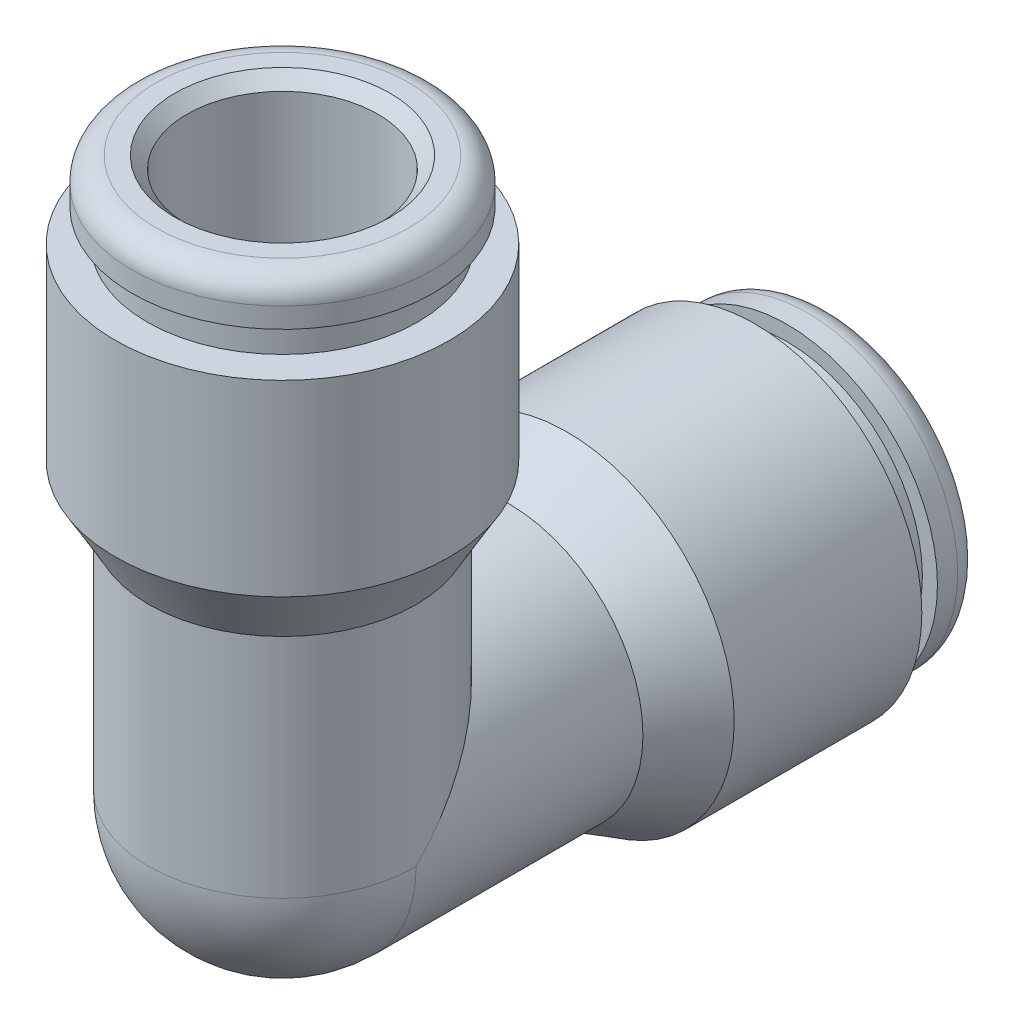
ISO-10303-21;
HEADER;
FILE_DESCRIPTION(('STEP AP214'),'2;1');
FILE_NAME('part.step','',(''),(''),'','','');
FILE_SCHEMA(('AUTOMOTIVE_DESIGN { 1 0 10303 214 1 1 1 1 }'));
ENDSEC;
DATA;
#1=APPLICATION_CONTEXT('core data for automotive mechanical design processes');
#2=APPLICATION_PROTOCOL_DEFINITION('international standard','automotive_design',2000,#1);
#3=PRODUCT_CONTEXT('',#1,'mechanical');
#4=PRODUCT('Part','Part','',(#3));
#5=PRODUCT_RELATED_PRODUCT_CATEGORY('part','',(#4));
#6=PRODUCT_DEFINITION_FORMATION('','',#4);
#7=PRODUCT_DEFINITION_CONTEXT('part definition',#1,'design');
#8=PRODUCT_DEFINITION('design','',#6,#7);
#9=PRODUCT_DEFINITION_SHAPE('','',#8);
#10=(LENGTH_UNIT() NAMED_UNIT(*) SI_UNIT(.MILLI.,.METRE.));
#11=(NAMED_UNIT(*) PLANE_ANGLE_UNIT() SI_UNIT($,.RADIAN.));
#12=(NAMED_UNIT(*) SI_UNIT($,.STERADIAN.) SOLID_ANGLE_UNIT());
#13=UNCERTAINTY_MEASURE_WITH_UNIT(LENGTH_MEASURE(1.E-05),#10,'distance_accuracy_value','');
#14=(GEOMETRIC_REPRESENTATION_CONTEXT(3) GLOBAL_UNCERTAINTY_ASSIGNED_CONTEXT((#13)) GLOBAL_UNIT_ASSIGNED_CONTEXT((#10,
#11,#12)) REPRESENTATION_CONTEXT('',''));
#15=CARTESIAN_POINT('',(0.,0.,0.));
#16=DIRECTION('',(0.,0.,1.));
#17=DIRECTION('',(1.,0.,0.));
#18=AXIS2_PLACEMENT_3D('',#15,#16,#17);
#19=CARTESIAN_POINT('',(0.,0.,0.));
#20=DIRECTION('',(0.,0.,1.));
#21=DIRECTION('',(1.,0.,0.));
#22=AXIS2_PLACEMENT_3D('',#19,#20,#21);
#23=CYLINDRICAL_SURFACE('',#22,2.238);
#24=CARTESIAN_POINT('',(0.,0.,-6.));
#25=DIRECTION('',(0.,0.,1.));
#26=DIRECTION('',(1.,0.,0.));
#27=AXIS2_PLACEMENT_3D('',#24,#25,#26);
#28=CIRCLE('',#27,2.238);
#29=CARTESIAN_POINT('',(2.238,0.,-6.));
#30=VERTEX_POINT('',#29);
#31=EDGE_CURVE('E11',#30,#30,#28,.T.);
#32=ORIENTED_EDGE('',*,*,#31,.F.);
#33=EDGE_LOOP('',(#32));
#34=FACE_BOUND('',#33,.T.);
#35=CARTESIAN_POINT('',(0.,0.,0.));
#36=DIRECTION('',(0.,0.707106781186546,0.707106781186549));
#37=DIRECTION('',(0.,-0.707106781186549,0.707106781186546));
#38=AXIS2_PLACEMENT_3D('',#35,#36,#37);
#39=ELLIPSE('',#38,3.16500995259098,2.238);
#40=CARTESIAN_POINT('',(-2.238,0.,0.));
#41=VERTEX_POINT('',#40);
#42=CARTESIAN_POINT('',(2.238,0.,0.));
#43=VERTEX_POINT('',#42);
#44=EDGE_CURVE('E65',#41,#43,#39,.F.);
#45=ORIENTED_EDGE('',*,*,#44,.F.);
#46=CARTESIAN_POINT('',(0.,0.,0.));
#47=DIRECTION('',(0.,0.,-1.));
#48=DIRECTION('',(1.,0.,0.));
#49=AXIS2_PLACEMENT_3D('',#46,#47,#48);
#50=CIRCLE('',#49,2.238);
#51=EDGE_CURVE('E75',#43,#41,#50,.T.);
#52=ORIENTED_EDGE('',*,*,#51,.F.);
#53=EDGE_LOOP('',(#45,#52));
#54=FACE_BOUND('',#53,.T.);
#55=ADVANCED_FACE('F38',(#34,#54),#23,.F.);
#56=CARTESIAN_POINT('',(0.,0.,0.));
#57=DIRECTION('',(0.,0.,1.));
#58=DIRECTION('',(1.,0.,0.));
#59=AXIS2_PLACEMENT_3D('',#56,#57,#58);
#60=CYLINDRICAL_SURFACE('',#59,4.2);
#61=CARTESIAN_POINT('',(0.,0.,-7.125));
#62=DIRECTION('',(0.,0.,1.));
#63=DIRECTION('',(1.,0.,0.));
#64=AXIS2_PLACEMENT_3D('',#61,#62,#63);
#65=CIRCLE('',#64,4.2);
#66=CARTESIAN_POINT('',(4.2,0.,-7.125));
#67=VERTEX_POINT('',#66);
#68=EDGE_CURVE('E47',#67,#67,#65,.T.);
#69=ORIENTED_EDGE('',*,*,#68,.T.);
#70=EDGE_LOOP('',(#69));
#71=FACE_BOUND('',#70,.T.);
#72=CARTESIAN_POINT('',(0.,0.,0.));
#73=DIRECTION('',(0.,0.707106781186546,0.707106781186549));
#74=DIRECTION('',(0.,-0.707106781186549,0.707106781186546));
#75=AXIS2_PLACEMENT_3D('',#72,#73,#74);
#76=ELLIPSE('',#75,5.93969696196699,4.2);
#77=CARTESIAN_POINT('',(4.2,0.,0.));
#78=VERTEX_POINT('',#77);
#79=CARTESIAN_POINT('',(-4.2,0.,0.));
#80=VERTEX_POINT('',#79);
#81=EDGE_CURVE('E84',#78,#80,#76,.T.);
#82=ORIENTED_EDGE('',*,*,#81,.F.);
#83=CARTESIAN_POINT('',(0.,0.,0.));
#84=DIRECTION('',(0.,0.,1.));
#85=DIRECTION('',(1.,0.,0.));
#86=AXIS2_PLACEMENT_3D('',#83,#84,#85);
#87=CIRCLE('',#86,4.2);
#88=EDGE_CURVE('E54',#80,#78,#87,.T.);
#89=ORIENTED_EDGE('',*,*,#88,.F.);
#90=EDGE_LOOP('',(#82,#89));
#91=FACE_BOUND('',#90,.T.);
#92=ADVANCED_FACE('F183',(#71,#91),#60,.T.);
#93=CARTESIAN_POINT('',(0.,3.,-6.));
#94=DIRECTION('',(0.,0.,1.));
#95=DIRECTION('',(1.,0.,0.));
#96=AXIS2_PLACEMENT_3D('',#93,#94,#95);
#97=PLANE('',#96);
#98=CARTESIAN_POINT('',(0.,0.,-6.));
#99=DIRECTION('',(0.,0.,1.));
#100=DIRECTION('',(1.,0.,0.));
#101=AXIS2_PLACEMENT_3D('',#98,#99,#100);
#102=CIRCLE('',#101,3.);
#103=CARTESIAN_POINT('',(3.,0.,-6.));
#104=VERTEX_POINT('',#103);
#105=EDGE_CURVE('E77',#104,#104,#102,.T.);
#106=ORIENTED_EDGE('',*,*,#105,.F.);
#107=EDGE_LOOP('',(#106));
#108=FACE_BOUND('',#107,.T.);
#109=ORIENTED_EDGE('',*,*,#31,.T.);
#110=EDGE_LOOP('',(#109));
#111=FACE_BOUND('',#110,.T.);
#112=ADVANCED_FACE('F40',(#108,#111),#97,.F.);
#113=CARTESIAN_POINT('',(0.,0.,-8.94365334794732));
#114=DIRECTION('',(0.,0.,-1.));
#115=DIRECTION('',(-1.,0.,0.));
#116=AXIS2_PLACEMENT_3D('',#113,#114,#115);
#117=CONICAL_SURFACE('',#116,5.25,0.523598775598301);
#118=ORIENTED_EDGE('',*,*,#68,.F.);
#119=EDGE_LOOP('',(#118));
#120=FACE_BOUND('',#119,.T.);
#121=CARTESIAN_POINT('',(0.,0.,-8.94365334794732));
#122=DIRECTION('',(0.,0.,1.));
#123=DIRECTION('',(1.,0.,0.));
#124=AXIS2_PLACEMENT_3D('',#121,#122,#123);
#125=CIRCLE('',#124,5.25);
#126=CARTESIAN_POINT('',(5.25,0.,-8.94365334794732));
#127=VERTEX_POINT('',#126);
#128=EDGE_CURVE('E120',#127,#127,#125,.T.);
#129=ORIENTED_EDGE('',*,*,#128,.T.);
#130=EDGE_LOOP('',(#129));
#131=FACE_BOUND('',#130,.T.);
#132=ADVANCED_FACE('F192',(#120,#131),#117,.T.);
#133=CARTESIAN_POINT('',(0.,0.,0.));
#134=DIRECTION('',(0.,0.,1.));
#135=DIRECTION('',(1.,0.,0.));
#136=AXIS2_PLACEMENT_3D('',#133,#134,#135);
#137=CYLINDRICAL_SURFACE('',#136,5.25);
#138=ORIENTED_EDGE('',*,*,#128,.F.);
#139=EDGE_LOOP('',(#138));
#140=FACE_BOUND('',#139,.T.);
#141=CARTESIAN_POINT('',(0.,0.,-14.837));
#142=DIRECTION('',(0.,0.,1.));
#143=DIRECTION('',(1.,0.,0.));
#144=AXIS2_PLACEMENT_3D('',#141,#142,#143);
#145=CIRCLE('',#144,5.25);
#146=CARTESIAN_POINT('',(5.25,0.,-14.837));
#147=VERTEX_POINT('',#146);
#148=EDGE_CURVE('E117',#147,#147,#145,.T.);
#149=ORIENTED_EDGE('',*,*,#148,.T.);
#150=EDGE_LOOP('',(#149));
#151=FACE_BOUND('',#150,.T.);
#152=ADVANCED_FACE('F195',(#140,#151),#137,.T.);
#153=CARTESIAN_POINT('',(0.,5.25,-14.837));
#154=DIRECTION('',(0.,0.,1.));
#155=DIRECTION('',(1.,0.,0.));
#156=AXIS2_PLACEMENT_3D('',#153,#154,#155);
#157=PLANE('',#156);
#158=ORIENTED_EDGE('',*,*,#148,.F.);
#159=EDGE_LOOP('',(#158));
#160=FACE_BOUND('',#159,.T.);
#161=CARTESIAN_POINT('',(0.,0.,-14.837));
#162=DIRECTION('',(0.,0.,1.));
#163=DIRECTION('',(1.,0.,0.));
#164=AXIS2_PLACEMENT_3D('',#161,#162,#163);
#165=CIRCLE('',#164,4.2525);
#166=CARTESIAN_POINT('',(4.2525,0.,-14.837));
#167=VERTEX_POINT('',#166);
#168=EDGE_CURVE('E114',#167,#167,#165,.T.);
#169=ORIENTED_EDGE('',*,*,#168,.T.);
#170=EDGE_LOOP('',(#169));
#171=FACE_BOUND('',#170,.T.);
#172=ADVANCED_FACE('F199',(#160,#171),#157,.F.);
#173=CARTESIAN_POINT('',(0.,0.,0.));
#174=DIRECTION('',(0.,0.,1.));
#175=DIRECTION('',(1.,0.,0.));
#176=AXIS2_PLACEMENT_3D('',#173,#174,#175);
#177=CYLINDRICAL_SURFACE('',#176,4.2525);
#178=ORIENTED_EDGE('',*,*,#168,.F.);
#179=EDGE_LOOP('',(#178));
#180=FACE_BOUND('',#179,.T.);
#181=CARTESIAN_POINT('',(0.,0.,-15.853));
#182=DIRECTION('',(0.,0.,1.));
#183=DIRECTION('',(1.,0.,0.));
#184=AXIS2_PLACEMENT_3D('',#181,#182,#183);
#185=CIRCLE('',#184,4.2525);
#186=CARTESIAN_POINT('',(4.2525,0.,-15.853));
#187=VERTEX_POINT('',#186);
#188=EDGE_CURVE('E111',#187,#187,#185,.T.);
#189=ORIENTED_EDGE('',*,*,#188,.T.);
#190=EDGE_LOOP('',(#189));
#191=FACE_BOUND('',#190,.T.);
#192=ADVANCED_FACE('F203',(#180,#191),#177,.T.);
#193=CARTESIAN_POINT('',(0.,4.725,-15.853));
#194=DIRECTION('',(0.,0.,-1.));
#195=DIRECTION('',(-1.,0.,0.));
#196=AXIS2_PLACEMENT_3D('',#193,#194,#195);
#197=PLANE('',#196);
#198=ORIENTED_EDGE('',*,*,#188,.F.);
#199=EDGE_LOOP('',(#198));
#200=FACE_BOUND('',#199,.T.);
#201=CARTESIAN_POINT('',(0.,0.,-15.853));
#202=DIRECTION('',(0.,0.,1.));
#203=DIRECTION('',(1.,0.,0.));
#204=AXIS2_PLACEMENT_3D('',#201,#202,#203);
#205=CIRCLE('',#204,4.725);
#206=CARTESIAN_POINT('',(4.725,0.,-15.853));
#207=VERTEX_POINT('',#206);
#208=EDGE_CURVE('E108',#207,#207,#205,.T.);
#209=ORIENTED_EDGE('',*,*,#208,.T.);
#210=EDGE_LOOP('',(#209));
#211=FACE_BOUND('',#210,.T.);
#212=ADVANCED_FACE('F207',(#200,#211),#197,.F.);
#213=CARTESIAN_POINT('',(0.,0.,0.));
#214=DIRECTION('',(0.,0.,1.));
#215=DIRECTION('',(1.,0.,0.));
#216=AXIS2_PLACEMENT_3D('',#213,#214,#215);
#217=CYLINDRICAL_SURFACE('',#216,4.725);
#218=ORIENTED_EDGE('',*,*,#208,.F.);
#219=EDGE_LOOP('',(#218));
#220=FACE_BOUND('',#219,.T.);
#221=CARTESIAN_POINT('',(0.,0.,-16.488));
#222=DIRECTION('',(0.,0.,1.));
#223=DIRECTION('',(1.,0.,0.));
#224=AXIS2_PLACEMENT_3D('',#221,#222,#223);
#225=CIRCLE('',#224,4.725);
#226=CARTESIAN_POINT('',(4.725,0.,-16.488));
#227=VERTEX_POINT('',#226);
#228=EDGE_CURVE('E105',#227,#227,#225,.T.);
#229=ORIENTED_EDGE('',*,*,#228,.T.);
#230=EDGE_LOOP('',(#229));
#231=FACE_BOUND('',#230,.T.);
#232=ADVANCED_FACE('F211',(#220,#231),#217,.T.);
#233=CARTESIAN_POINT('',(0.,0.,-16.488));
#234=DIRECTION('',(0.,0.,1.));
#235=DIRECTION('',(1.,0.,0.));
#236=AXIS2_PLACEMENT_3D('',#233,#234,#235);
#237=TOROIDAL_SURFACE('',#236,3.963,0.761999999999999);
#238=ORIENTED_EDGE('',*,*,#228,.F.);
#239=EDGE_LOOP('',(#238));
#240=FACE_BOUND('',#239,.T.);
#241=CARTESIAN_POINT('',(0.,0.,-17.25));
#242=DIRECTION('',(0.,0.,1.));
#243=DIRECTION('',(1.,0.,0.));
#244=AXIS2_PLACEMENT_3D('',#241,#242,#243);
#245=CIRCLE('',#244,3.963);
#246=CARTESIAN_POINT('',(3.963,0.,-17.25));
#247=VERTEX_POINT('',#246);
#248=EDGE_CURVE('E102',#247,#247,#245,.T.);
#249=ORIENTED_EDGE('',*,*,#248,.T.);
#250=EDGE_LOOP('',(#249));
#251=FACE_BOUND('',#250,.T.);
#252=ADVANCED_FACE('F215',(#240,#251),#237,.T.);
#253=CARTESIAN_POINT('',(0.,3.963,-17.25));
#254=DIRECTION('',(0.,0.,1.));
#255=DIRECTION('',(1.,0.,0.));
#256=AXIS2_PLACEMENT_3D('',#253,#254,#255);
#257=PLANE('',#256);
#258=ORIENTED_EDGE('',*,*,#248,.F.);
#259=EDGE_LOOP('',(#258));
#260=FACE_BOUND('',#259,.T.);
#261=CARTESIAN_POINT('',(0.,0.,-17.25));
#262=DIRECTION('',(0.,0.,1.));
#263=DIRECTION('',(1.,0.,0.));
#264=AXIS2_PLACEMENT_3D('',#261,#262,#263);
#265=CIRCLE('',#264,3.381);
#266=CARTESIAN_POINT('',(3.381,0.,-17.25));
#267=VERTEX_POINT('',#266);
#268=EDGE_CURVE('E99',#267,#267,#265,.T.);
#269=ORIENTED_EDGE('',*,*,#268,.T.);
#270=EDGE_LOOP('',(#269));
#271=FACE_BOUND('',#270,.T.);
#272=ADVANCED_FACE('F219',(#260,#271),#257,.F.);
#273=CARTESIAN_POINT('',(0.,0.,-16.869));
#274=DIRECTION('',(0.,0.,-1.));
#275=DIRECTION('',(-1.,0.,0.));
#276=AXIS2_PLACEMENT_3D('',#273,#274,#275);
#277=CONICAL_SURFACE('',#276,3.,0.78539816339745);
#278=ORIENTED_EDGE('',*,*,#268,.F.);
#279=EDGE_LOOP('',(#278));
#280=FACE_BOUND('',#279,.T.);
#281=CARTESIAN_POINT('',(0.,0.,-16.869));
#282=DIRECTION('',(0.,0.,1.));
#283=DIRECTION('',(1.,0.,0.));
#284=AXIS2_PLACEMENT_3D('',#281,#282,#283);
#285=CIRCLE('',#284,3.);
#286=CARTESIAN_POINT('',(3.,0.,-16.869));
#287=VERTEX_POINT('',#286);
#288=EDGE_CURVE('E96',#287,#287,#285,.T.);
#289=ORIENTED_EDGE('',*,*,#288,.T.);
#290=EDGE_LOOP('',(#289));
#291=FACE_BOUND('',#290,.T.);
#292=ADVANCED_FACE('F223',(#280,#291),#277,.F.);
#293=CARTESIAN_POINT('',(0.,0.,0.));
#294=DIRECTION('',(0.,0.,1.));
#295=DIRECTION('',(1.,0.,0.));
#296=AXIS2_PLACEMENT_3D('',#293,#294,#295);
#297=CYLINDRICAL_SURFACE('',#296,3.);
#298=ORIENTED_EDGE('',*,*,#288,.F.);
#299=EDGE_LOOP('',(#298));
#300=FACE_BOUND('',#299,.T.);
#301=ORIENTED_EDGE('',*,*,#105,.T.);
#302=EDGE_LOOP('',(#301));
#303=FACE_BOUND('',#302,.T.);
#304=ADVANCED_FACE('F227',(#300,#303),#297,.F.);
#305=CARTESIAN_POINT('',(0.,0.,0.));
#306=DIRECTION('',(1.,0.,0.));
#307=DIRECTION('',(0.,0.,1.));
#308=AXIS2_PLACEMENT_3D('',#305,#306,#307);
#309=SPHERICAL_SURFACE('',#308,4.2);
#310=ORIENTED_EDGE('',*,*,#88,.T.);
#311=CARTESIAN_POINT('',(0.,0.,0.));
#312=DIRECTION('',(0.,-1.,0.));
#313=DIRECTION('',(1.,0.,0.));
#314=AXIS2_PLACEMENT_3D('',#311,#312,#313);
#315=CIRCLE('',#314,4.2);
#316=EDGE_CURVE('E81',#78,#80,#315,.T.);
#317=ORIENTED_EDGE('',*,*,#316,.T.);
#318=EDGE_LOOP('',(#310,#317));
#319=FACE_BOUND('',#318,.T.);
#320=ADVANCED_FACE('F231',(#319),#309,.T.);
#321=CARTESIAN_POINT('',(0.,0.,0.));
#322=DIRECTION('',(1.,0.,0.));
#323=DIRECTION('',(0.,0.,-1.));
#324=AXIS2_PLACEMENT_3D('',#321,#322,#323);
#325=SPHERICAL_SURFACE('',#324,2.238);
#326=ORIENTED_EDGE('',*,*,#51,.T.);
#327=CARTESIAN_POINT('',(0.,0.,0.));
#328=DIRECTION('',(0.,-1.,0.));
#329=DIRECTION('',(1.,0.,0.));
#330=AXIS2_PLACEMENT_3D('',#327,#328,#329);
#331=CIRCLE('',#330,2.238);
#332=EDGE_CURVE('E70',#43,#41,#331,.T.);
#333=ORIENTED_EDGE('',*,*,#332,.F.);
#334=EDGE_LOOP('',(#326,#333));
#335=FACE_BOUND('',#334,.T.);
#336=ADVANCED_FACE('F79',(#335),#325,.F.);
#337=CARTESIAN_POINT('',(0.,0.,0.));
#338=DIRECTION('',(0.,-1.,0.));
#339=DIRECTION('',(1.,0.,0.));
#340=AXIS2_PLACEMENT_3D('',#337,#338,#339);
#341=CYLINDRICAL_SURFACE('',#340,3.);
#342=CARTESIAN_POINT('',(0.,16.869,0.));
#343=DIRECTION('',(0.,-1.,0.));
#344=DIRECTION('',(1.,0.,0.));
#345=AXIS2_PLACEMENT_3D('',#342,#343,#344);
#346=CIRCLE('',#345,3.);
#347=CARTESIAN_POINT('',(3.,16.869,0.));
#348=VERTEX_POINT('',#347);
#349=EDGE_CURVE('E158',#348,#348,#346,.T.);
#350=ORIENTED_EDGE('',*,*,#349,.F.);
#351=EDGE_LOOP('',(#350));
#352=FACE_BOUND('',#351,.T.);
#353=CARTESIAN_POINT('',(0.,6.,0.));
#354=DIRECTION('',(0.,-1.,0.));
#355=DIRECTION('',(1.,0.,0.));
#356=AXIS2_PLACEMENT_3D('',#353,#354,#355);
#357=CIRCLE('',#356,3.);
#358=CARTESIAN_POINT('',(3.,6.,0.));
#359=VERTEX_POINT('',#358);
#360=EDGE_CURVE('E73',#359,#359,#357,.T.);
#361=ORIENTED_EDGE('',*,*,#360,.T.);
#362=EDGE_LOOP('',(#361));
#363=FACE_BOUND('',#362,.T.);
#364=ADVANCED_FACE('F166',(#352,#363),#341,.F.);
#365=CARTESIAN_POINT('',(0.,16.869,0.));
#366=DIRECTION('',(0.,1.,0.));
#367=DIRECTION('',(-1.,0.,0.));
#368=AXIS2_PLACEMENT_3D('',#365,#366,#367);
#369=CONICAL_SURFACE('',#368,3.,0.78539816339745);
#370=CARTESIAN_POINT('',(0.,17.25,0.));
#371=DIRECTION('',(0.,-1.,0.));
#372=DIRECTION('',(1.,0.,0.));
#373=AXIS2_PLACEMENT_3D('',#370,#371,#372);
#374=CIRCLE('',#373,3.381);
#375=CARTESIAN_POINT('',(3.381,17.25,0.));
#376=VERTEX_POINT('',#375);
#377=EDGE_CURVE('E155',#376,#376,#374,.T.);
#378=ORIENTED_EDGE('',*,*,#377,.F.);
#379=EDGE_LOOP('',(#378));
#380=FACE_BOUND('',#379,.T.);
#381=ORIENTED_EDGE('',*,*,#349,.T.);
#382=EDGE_LOOP('',(#381));
#383=FACE_BOUND('',#382,.T.);
#384=ADVANCED_FACE('F251',(#380,#383),#369,.F.);
#385=CARTESIAN_POINT('',(0.,17.25,3.96300000000006));
#386=DIRECTION('',(0.,-1.,0.));
#387=DIRECTION('',(1.,0.,0.));
#388=AXIS2_PLACEMENT_3D('',#385,#386,#387);
#389=PLANE('',#388);
#390=CARTESIAN_POINT('',(0.,17.25,0.));
#391=DIRECTION('',(0.,-1.,0.));
#392=DIRECTION('',(1.,0.,0.));
#393=AXIS2_PLACEMENT_3D('',#390,#391,#392);
#394=CIRCLE('',#393,3.963);
#395=CARTESIAN_POINT('',(3.963,17.25,0.));
#396=VERTEX_POINT('',#395);
#397=EDGE_CURVE('E152',#396,#396,#394,.T.);
#398=ORIENTED_EDGE('',*,*,#397,.F.);
#399=EDGE_LOOP('',(#398));
#400=FACE_BOUND('',#399,.T.);
#401=ORIENTED_EDGE('',*,*,#377,.T.);
#402=EDGE_LOOP('',(#401));
#403=FACE_BOUND('',#402,.T.);
#404=ADVANCED_FACE('F260',(#400,#403),#389,.F.);
#405=CARTESIAN_POINT('',(0.,16.488,0.));
#406=DIRECTION('',(0.,-1.,0.));
#407=DIRECTION('',(1.,0.,0.));
#408=AXIS2_PLACEMENT_3D('',#405,#406,#407);
#409=TOROIDAL_SURFACE('',#408,3.963,0.761999999999999);
#410=CARTESIAN_POINT('',(0.,16.488,0.));
#411=DIRECTION('',(0.,-1.,0.));
#412=DIRECTION('',(1.,0.,0.));
#413=AXIS2_PLACEMENT_3D('',#410,#411,#412);
#414=CIRCLE('',#413,4.725);
#415=CARTESIAN_POINT('',(4.725,16.488,0.));
#416=VERTEX_POINT('',#415);
#417=EDGE_CURVE('E149',#416,#416,#414,.T.);
#418=ORIENTED_EDGE('',*,*,#417,.F.);
#419=EDGE_LOOP('',(#418));
#420=FACE_BOUND('',#419,.T.);
#421=ORIENTED_EDGE('',*,*,#397,.T.);
#422=EDGE_LOOP('',(#421));
#423=FACE_BOUND('',#422,.T.);
#424=ADVANCED_FACE('F270',(#420,#423),#409,.T.);
#425=CARTESIAN_POINT('',(0.,0.,0.));
#426=DIRECTION('',(0.,-1.,0.));
#427=DIRECTION('',(1.,0.,0.));
#428=AXIS2_PLACEMENT_3D('',#425,#426,#427);
#429=CYLINDRICAL_SURFACE('',#428,4.725);
#430=CARTESIAN_POINT('',(0.,15.853,0.));
#431=DIRECTION('',(0.,-1.,0.));
#432=DIRECTION('',(1.,0.,0.));
#433=AXIS2_PLACEMENT_3D('',#430,#431,#432);
#434=CIRCLE('',#433,4.725);
#435=CARTESIAN_POINT('',(4.725,15.853,0.));
#436=VERTEX_POINT('',#435);
#437=EDGE_CURVE('E146',#436,#436,#434,.T.);
#438=ORIENTED_EDGE('',*,*,#437,.F.);
#439=EDGE_LOOP('',(#438));
#440=FACE_BOUND('',#439,.T.);
#441=ORIENTED_EDGE('',*,*,#417,.T.);
#442=EDGE_LOOP('',(#441));
#443=FACE_BOUND('',#442,.T.);
#444=ADVANCED_FACE('F278',(#440,#443),#429,.T.);
#445=CARTESIAN_POINT('',(0.,15.853,4.72500000000006));
#446=DIRECTION('',(0.,1.,0.));
#447=DIRECTION('',(-1.,0.,0.));
#448=AXIS2_PLACEMENT_3D('',#445,#446,#447);
#449=PLANE('',#448);
#450=CARTESIAN_POINT('',(0.,15.853,0.));
#451=DIRECTION('',(0.,-1.,0.));
#452=DIRECTION('',(1.,0.,0.));
#453=AXIS2_PLACEMENT_3D('',#450,#451,#452);
#454=CIRCLE('',#453,4.2525);
#455=CARTESIAN_POINT('',(4.2525,15.853,0.));
#456=VERTEX_POINT('',#455);
#457=EDGE_CURVE('E143',#456,#456,#454,.T.);
#458=ORIENTED_EDGE('',*,*,#457,.F.);
#459=EDGE_LOOP('',(#458));
#460=FACE_BOUND('',#459,.T.);
#461=ORIENTED_EDGE('',*,*,#437,.T.);
#462=EDGE_LOOP('',(#461));
#463=FACE_BOUND('',#462,.T.);
#464=ADVANCED_FACE('F285',(#460,#463),#449,.F.);
#465=CARTESIAN_POINT('',(0.,0.,0.));
#466=DIRECTION('',(0.,-1.,0.));
#467=DIRECTION('',(1.,0.,0.));
#468=AXIS2_PLACEMENT_3D('',#465,#466,#467);
#469=CYLINDRICAL_SURFACE('',#468,4.2525);
#470=CARTESIAN_POINT('',(0.,14.837,0.));
#471=DIRECTION('',(0.,-1.,0.));
#472=DIRECTION('',(1.,0.,0.));
#473=AXIS2_PLACEMENT_3D('',#470,#471,#472);
#474=CIRCLE('',#473,4.2525);
#475=CARTESIAN_POINT('',(4.2525,14.837,0.));
#476=VERTEX_POINT('',#475);
#477=EDGE_CURVE('E140',#476,#476,#474,.T.);
#478=ORIENTED_EDGE('',*,*,#477,.F.);
#479=EDGE_LOOP('',(#478));
#480=FACE_BOUND('',#479,.T.);
#481=ORIENTED_EDGE('',*,*,#457,.T.);
#482=EDGE_LOOP('',(#481));
#483=FACE_BOUND('',#482,.T.);
#484=ADVANCED_FACE('F293',(#480,#483),#469,.T.);
#485=CARTESIAN_POINT('',(0.,14.837,5.25000000000005));
#486=DIRECTION('',(0.,-1.,0.));
#487=DIRECTION('',(1.,0.,0.));
#488=AXIS2_PLACEMENT_3D('',#485,#486,#487);
#489=PLANE('',#488);
#490=CARTESIAN_POINT('',(0.,14.837,0.));
#491=DIRECTION('',(0.,-1.,0.));
#492=DIRECTION('',(1.,0.,0.));
#493=AXIS2_PLACEMENT_3D('',#490,#491,#492);
#494=CIRCLE('',#493,5.25);
#495=CARTESIAN_POINT('',(5.25,14.837,0.));
#496=VERTEX_POINT('',#495);
#497=EDGE_CURVE('E137',#496,#496,#494,.T.);
#498=ORIENTED_EDGE('',*,*,#497,.F.);
#499=EDGE_LOOP('',(#498));
#500=FACE_BOUND('',#499,.T.);
#501=ORIENTED_EDGE('',*,*,#477,.T.);
#502=EDGE_LOOP('',(#501));
#503=FACE_BOUND('',#502,.T.);
#504=ADVANCED_FACE('F301',(#500,#503),#489,.F.);
#505=CARTESIAN_POINT('',(0.,0.,0.));
#506=DIRECTION('',(0.,-1.,0.));
#507=DIRECTION('',(1.,0.,0.));
#508=AXIS2_PLACEMENT_3D('',#505,#506,#507);
#509=CYLINDRICAL_SURFACE('',#508,5.25);
#510=CARTESIAN_POINT('',(0.,8.94365334794732,0.));
#511=DIRECTION('',(0.,-1.,0.));
#512=DIRECTION('',(1.,0.,0.));
#513=AXIS2_PLACEMENT_3D('',#510,#511,#512);
#514=CIRCLE('',#513,5.25);
#515=CARTESIAN_POINT('',(5.25,8.94365334794732,0.));
#516=VERTEX_POINT('',#515);
#517=EDGE_CURVE('E134',#516,#516,#514,.T.);
#518=ORIENTED_EDGE('',*,*,#517,.F.);
#519=EDGE_LOOP('',(#518));
#520=FACE_BOUND('',#519,.T.);
#521=ORIENTED_EDGE('',*,*,#497,.T.);
#522=EDGE_LOOP('',(#521));
#523=FACE_BOUND('',#522,.T.);
#524=ADVANCED_FACE('F309',(#520,#523),#509,.T.);
#525=CARTESIAN_POINT('',(0.,8.94365334794732,0.));
#526=DIRECTION('',(0.,1.,0.));
#527=DIRECTION('',(-1.,0.,0.));
#528=AXIS2_PLACEMENT_3D('',#525,#526,#527);
#529=CONICAL_SURFACE('',#528,5.25,0.523598775598301);
#530=CARTESIAN_POINT('',(0.,7.125,0.));
#531=DIRECTION('',(0.,-1.,0.));
#532=DIRECTION('',(1.,0.,0.));
#533=AXIS2_PLACEMENT_3D('',#530,#531,#532);
#534=CIRCLE('',#533,4.2);
#535=CARTESIAN_POINT('',(4.2,7.125,0.));
#536=VERTEX_POINT('',#535);
#537=EDGE_CURVE('E86',#536,#536,#534,.T.);
#538=ORIENTED_EDGE('',*,*,#537,.F.);
#539=EDGE_LOOP('',(#538));
#540=FACE_BOUND('',#539,.T.);
#541=ORIENTED_EDGE('',*,*,#517,.T.);
#542=EDGE_LOOP('',(#541));
#543=FACE_BOUND('',#542,.T.);
#544=ADVANCED_FACE('F172',(#540,#543),#529,.T.);
#545=CARTESIAN_POINT('',(0.,5.99999999999999,3.00000000000002));
#546=DIRECTION('',(0.,-1.,0.));
#547=DIRECTION('',(1.,0.,0.));
#548=AXIS2_PLACEMENT_3D('',#545,#546,#547);
#549=PLANE('',#548);
#550=ORIENTED_EDGE('',*,*,#360,.F.);
#551=EDGE_LOOP('',(#550));
#552=FACE_BOUND('',#551,.T.);
#553=CARTESIAN_POINT('',(0.,6.,0.));
#554=DIRECTION('',(0.,-1.,0.));
#555=DIRECTION('',(1.,0.,0.));
#556=AXIS2_PLACEMENT_3D('',#553,#554,#555);
#557=CIRCLE('',#556,2.238);
#558=CARTESIAN_POINT('',(2.238,6.,0.));
#559=VERTEX_POINT('',#558);
#560=EDGE_CURVE('E80',#559,#559,#557,.T.);
#561=ORIENTED_EDGE('',*,*,#560,.T.);
#562=EDGE_LOOP('',(#561));
#563=FACE_BOUND('',#562,.T.);
#564=ADVANCED_FACE('F168',(#552,#563),#549,.F.);
#565=CARTESIAN_POINT('',(0.,0.,0.));
#566=DIRECTION('',(0.,-1.,0.));
#567=DIRECTION('',(1.,0.,0.));
#568=AXIS2_PLACEMENT_3D('',#565,#566,#567);
#569=CYLINDRICAL_SURFACE('',#568,4.2);
#570=ORIENTED_EDGE('',*,*,#537,.T.);
#571=EDGE_LOOP('',(#570));
#572=FACE_BOUND('',#571,.T.);
#573=ORIENTED_EDGE('',*,*,#316,.F.);
#574=ORIENTED_EDGE('',*,*,#81,.T.);
#575=EDGE_LOOP('',(#573,#574));
#576=FACE_BOUND('',#575,.T.);
#577=ADVANCED_FACE('F171',(#572,#576),#569,.T.);
#578=CARTESIAN_POINT('',(0.,0.,0.));
#579=DIRECTION('',(0.,-1.,0.));
#580=DIRECTION('',(1.,0.,0.));
#581=AXIS2_PLACEMENT_3D('',#578,#579,#580);
#582=CYLINDRICAL_SURFACE('',#581,2.238);
#583=ORIENTED_EDGE('',*,*,#44,.T.);
#584=ORIENTED_EDGE('',*,*,#332,.T.);
#585=EDGE_LOOP('',(#583,#584));
#586=FACE_BOUND('',#585,.T.);
#587=ORIENTED_EDGE('',*,*,#560,.F.);
#588=EDGE_LOOP('',(#587));
#589=FACE_BOUND('',#588,.T.);
#590=ADVANCED_FACE('F67',(#586,#589),#582,.F.);
#591=CLOSED_SHELL('',(#55,#92,#112,#132,#152,#172,#192,#212,#232,#252,#272,#292,#304,#320,#336,
#364,#384,#404,#424,#444,#464,#484,#504,#524,#544,#564,#577,#590));
#592=MANIFOLD_SOLID_BREP('B2',#591);
#593=ADVANCED_BREP_SHAPE_REPRESENTATION('',(#18,#592),#14);
#594=SHAPE_DEFINITION_REPRESENTATION(#9,#593);
ENDSEC;
END-ISO-10303-21;
